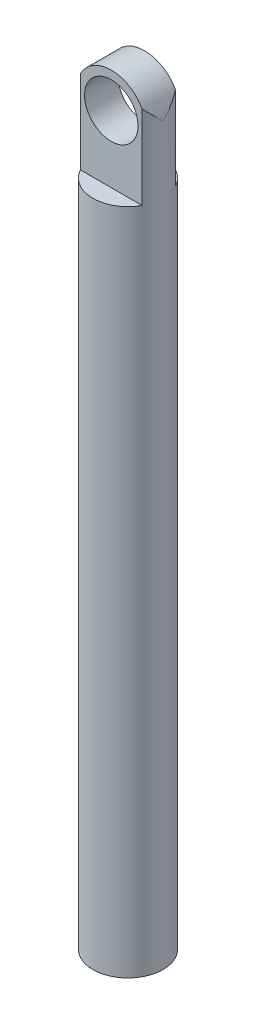
ISO-10303-21;
HEADER;
FILE_DESCRIPTION(('STEP AP214'),'2;1');
FILE_NAME('part.step','',(''),(''),'','','');
FILE_SCHEMA(('AUTOMOTIVE_DESIGN { 1 0 10303 214 1 1 1 1 }'));
ENDSEC;
DATA;
#1=APPLICATION_CONTEXT('core data for automotive mechanical design processes');
#2=APPLICATION_PROTOCOL_DEFINITION('international standard','automotive_design',2000,#1);
#3=PRODUCT_CONTEXT('',#1,'mechanical');
#4=PRODUCT('Part','Part','',(#3));
#5=PRODUCT_RELATED_PRODUCT_CATEGORY('part','',(#4));
#6=PRODUCT_DEFINITION_FORMATION('','',#4);
#7=PRODUCT_DEFINITION_CONTEXT('part definition',#1,'design');
#8=PRODUCT_DEFINITION('design','',#6,#7);
#9=PRODUCT_DEFINITION_SHAPE('','',#8);
#10=(LENGTH_UNIT() NAMED_UNIT(*) SI_UNIT(.MILLI.,.METRE.));
#11=(NAMED_UNIT(*) PLANE_ANGLE_UNIT() SI_UNIT($,.RADIAN.));
#12=(NAMED_UNIT(*) SI_UNIT($,.STERADIAN.) SOLID_ANGLE_UNIT());
#13=UNCERTAINTY_MEASURE_WITH_UNIT(LENGTH_MEASURE(1.E-05),#10,'distance_accuracy_value','');
#14=(GEOMETRIC_REPRESENTATION_CONTEXT(3) GLOBAL_UNCERTAINTY_ASSIGNED_CONTEXT((#13)) GLOBAL_UNIT_ASSIGNED_CONTEXT((#10,
#11,#12)) REPRESENTATION_CONTEXT('',''));
#15=CARTESIAN_POINT('',(0.,0.,0.));
#16=DIRECTION('',(0.,0.,1.));
#17=DIRECTION('',(1.,0.,0.));
#18=AXIS2_PLACEMENT_3D('',#15,#16,#17);
#19=CARTESIAN_POINT('',(0.,100.,0.));
#20=DIRECTION('',(0.,1.,0.));
#21=DIRECTION('',(0.,0.,1.));
#22=AXIS2_PLACEMENT_3D('',#19,#20,#21);
#23=PLANE('',#22);
#24=CARTESIAN_POINT('',(0.,100.,0.));
#25=DIRECTION('',(0.,1.,0.));
#26=DIRECTION('',(0.,0.,1.));
#27=AXIS2_PLACEMENT_3D('',#24,#25,#26);
#28=CIRCLE('',#27,5.25);
#29=CARTESIAN_POINT('',(4.61654632815485,100.,-2.5));
#30=VERTEX_POINT('',#29);
#31=CARTESIAN_POINT('',(-4.61654632815484,100.,-2.5));
#32=VERTEX_POINT('',#31);
#33=EDGE_CURVE('E104',#30,#32,#28,.T.);
#34=ORIENTED_EDGE('',*,*,#33,.T.);
#35=DIRECTION('',(1.,0.,0.));
#36=VECTOR('',#35,1.);
#37=CARTESIAN_POINT('',(-5.25,100.,-2.5));
#38=LINE('',#37,#36);
#39=EDGE_CURVE('E109',#32,#30,#38,.T.);
#40=ORIENTED_EDGE('',*,*,#39,.T.);
#41=EDGE_LOOP('',(#34,#40));
#42=FACE_BOUND('',#41,.T.);
#43=ADVANCED_FACE('F42',(#42),#23,.T.);
#44=CARTESIAN_POINT('',(0.,100.,0.));
#45=DIRECTION('',(0.,-1.,0.));
#46=DIRECTION('',(0.,0.,-1.));
#47=AXIS2_PLACEMENT_3D('',#44,#45,#46);
#48=CYLINDRICAL_SURFACE('',#47,5.25);
#49=DIRECTION('',(0.,-1.,0.));
#50=VECTOR('',#49,1.);
#51=CARTESIAN_POINT('',(4.61654632815484,115.25,2.5));
#52=LINE('',#51,#50);
#53=CARTESIAN_POINT('',(4.61654632815484,100.,2.5));
#54=VERTEX_POINT('',#53);
#55=CARTESIAN_POINT('',(4.61654632815484,112.5,2.5));
#56=VERTEX_POINT('',#55);
#57=EDGE_CURVE('E88',#54,#56,#52,.F.);
#58=ORIENTED_EDGE('',*,*,#57,.F.);
#59=CARTESIAN_POINT('',(-4.61654632815484,100.,2.5));
#60=VERTEX_POINT('',#59);
#61=EDGE_CURVE('E91',#60,#54,#28,.T.);
#62=ORIENTED_EDGE('',*,*,#61,.F.);
#63=DIRECTION('',(0.,-1.,0.));
#64=VECTOR('',#63,1.);
#65=CARTESIAN_POINT('',(-4.61654632815484,115.25,2.5));
#66=LINE('',#65,#64);
#67=CARTESIAN_POINT('',(-4.61654632815484,112.5,2.5));
#68=VERTEX_POINT('',#67);
#69=EDGE_CURVE('E108',#68,#60,#66,.T.);
#70=ORIENTED_EDGE('',*,*,#69,.F.);
#71=CARTESIAN_POINT('',(0.,110.,0.));
#72=DIRECTION('',(0.,0.707106781186547,-0.707106781186548));
#73=DIRECTION('',(0.,-0.707106781186547,-0.707106781186548));
#74=AXIS2_PLACEMENT_3D('',#71,#72,#73);
#75=ELLIPSE('',#74,7.42462120245875,5.25);
#76=CARTESIAN_POINT('',(-5.25,110.,0.));
#77=VERTEX_POINT('',#76);
#78=EDGE_CURVE('E98',#77,#68,#75,.T.);
#79=ORIENTED_EDGE('',*,*,#78,.F.);
#80=CARTESIAN_POINT('',(0.,110.,0.));
#81=DIRECTION('',(0.,-0.707106781186547,-0.707106781186548));
#82=DIRECTION('',(0.,0.707106781186547,-0.707106781186548));
#83=AXIS2_PLACEMENT_3D('',#80,#81,#82);
#84=ELLIPSE('',#83,7.42462120245875,5.25);
#85=CARTESIAN_POINT('',(-4.61654632815484,112.5,-2.5));
#86=VERTEX_POINT('',#85);
#87=EDGE_CURVE('E58',#86,#77,#84,.F.);
#88=ORIENTED_EDGE('',*,*,#87,.F.);
#89=DIRECTION('',(0.,-1.,0.));
#90=VECTOR('',#89,1.);
#91=CARTESIAN_POINT('',(-4.61654632815484,115.25,-2.5));
#92=LINE('',#91,#90);
#93=EDGE_CURVE('E51',#86,#32,#92,.T.);
#94=ORIENTED_EDGE('',*,*,#93,.T.);
#95=ORIENTED_EDGE('',*,*,#33,.F.);
#96=DIRECTION('',(0.,-1.,0.));
#97=VECTOR('',#96,1.);
#98=CARTESIAN_POINT('',(4.61654632815484,115.25,-2.5));
#99=LINE('',#98,#97);
#100=CARTESIAN_POINT('',(4.61654632815484,112.5,-2.5));
#101=VERTEX_POINT('',#100);
#102=EDGE_CURVE('E12',#30,#101,#99,.F.);
#103=ORIENTED_EDGE('',*,*,#102,.T.);
#104=CARTESIAN_POINT('',(5.25,110.,0.));
#105=VERTEX_POINT('',#104);
#106=EDGE_CURVE('E172',#105,#101,#84,.F.);
#107=ORIENTED_EDGE('',*,*,#106,.F.);
#108=EDGE_CURVE('E93',#56,#105,#75,.T.);
#109=ORIENTED_EDGE('',*,*,#108,.F.);
#110=EDGE_LOOP('',(#58,#62,#70,#79,#88,#94,#95,#103,#107,#109));
#111=FACE_BOUND('',#110,.T.);
#112=CARTESIAN_POINT('',(0.,0.,0.));
#113=DIRECTION('',(0.,1.,0.));
#114=DIRECTION('',(0.,0.,1.));
#115=AXIS2_PLACEMENT_3D('',#112,#113,#114);
#116=CIRCLE('',#115,5.25);
#117=CARTESIAN_POINT('',(0.,0.,5.25));
#118=VERTEX_POINT('',#117);
#119=EDGE_CURVE('E105',#118,#118,#116,.T.);
#120=ORIENTED_EDGE('',*,*,#119,.T.);
#121=EDGE_LOOP('',(#120));
#122=FACE_BOUND('',#121,.T.);
#123=ADVANCED_FACE('F44',(#111,#122),#48,.T.);
#124=DIRECTION('',(1.,0.,0.));
#125=VECTOR('',#124,1.);
#126=CARTESIAN_POINT('',(-5.25,100.,2.5));
#127=LINE('',#126,#125);
#128=EDGE_CURVE('E103',#60,#54,#127,.T.);
#129=ORIENTED_EDGE('',*,*,#128,.F.);
#130=ORIENTED_EDGE('',*,*,#61,.T.);
#131=EDGE_LOOP('',(#129,#130));
#132=FACE_BOUND('',#131,.T.);
#133=ADVANCED_FACE('F102',(#132),#23,.T.);
#134=CARTESIAN_POINT('',(0.,0.,0.));
#135=DIRECTION('',(0.,1.,0.));
#136=DIRECTION('',(0.,0.,1.));
#137=AXIS2_PLACEMENT_3D('',#134,#135,#136);
#138=PLANE('',#137);
#139=CARTESIAN_POINT('',(0.,0.,0.));
#140=DIRECTION('',(0.,-1.,0.));
#141=DIRECTION('',(0.,0.,-1.));
#142=AXIS2_PLACEMENT_3D('',#139,#140,#141);
#143=CIRCLE('',#142,2.65);
#144=CARTESIAN_POINT('',(0.,0.,-2.65));
#145=VERTEX_POINT('',#144);
#146=EDGE_CURVE('E160',#145,#145,#143,.T.);
#147=ORIENTED_EDGE('',*,*,#146,.F.);
#148=EDGE_LOOP('',(#147));
#149=FACE_BOUND('',#148,.T.);
#150=ORIENTED_EDGE('',*,*,#119,.F.);
#151=EDGE_LOOP('',(#150));
#152=FACE_BOUND('',#151,.T.);
#153=ADVANCED_FACE('F147',(#149,#152),#138,.F.);
#154=CARTESIAN_POINT('',(0.,110.,2.5));
#155=DIRECTION('',(0.,0.,-1.));
#156=DIRECTION('',(-1.,0.,0.));
#157=AXIS2_PLACEMENT_3D('',#154,#155,#156);
#158=CYLINDRICAL_SURFACE('',#157,5.25);
#159=CARTESIAN_POINT('',(0.,110.,-2.5));
#160=DIRECTION('',(0.,0.,1.));
#161=DIRECTION('',(-1.,0.,0.));
#162=AXIS2_PLACEMENT_3D('',#159,#160,#161);
#163=CIRCLE('',#162,5.25);
#164=EDGE_CURVE('E116',#101,#86,#163,.T.);
#165=ORIENTED_EDGE('',*,*,#164,.T.);
#166=ORIENTED_EDGE('',*,*,#87,.T.);
#167=ORIENTED_EDGE('',*,*,#78,.T.);
#168=CARTESIAN_POINT('',(0.,110.,2.5));
#169=DIRECTION('',(0.,0.,1.));
#170=DIRECTION('',(-1.,0.,0.));
#171=AXIS2_PLACEMENT_3D('',#168,#169,#170);
#172=CIRCLE('',#171,5.25);
#173=EDGE_CURVE('E115',#56,#68,#172,.T.);
#174=ORIENTED_EDGE('',*,*,#173,.F.);
#175=ORIENTED_EDGE('',*,*,#108,.T.);
#176=ORIENTED_EDGE('',*,*,#106,.T.);
#177=EDGE_LOOP('',(#165,#166,#167,#174,#175,#176));
#178=FACE_BOUND('',#177,.T.);
#179=ADVANCED_FACE('F136',(#178),#158,.T.);
#180=CARTESIAN_POINT('',(0.,110.,2.5));
#181=DIRECTION('',(0.,0.,-1.));
#182=DIRECTION('',(-1.,0.,0.));
#183=AXIS2_PLACEMENT_3D('',#180,#181,#182);
#184=PLANE('',#183);
#185=CARTESIAN_POINT('',(0.,110.,2.5));
#186=DIRECTION('',(0.,0.,1.));
#187=DIRECTION('',(1.,0.,0.));
#188=AXIS2_PLACEMENT_3D('',#185,#186,#187);
#189=CIRCLE('',#188,4.);
#190=CARTESIAN_POINT('',(4.,110.,2.5));
#191=VERTEX_POINT('',#190);
#192=EDGE_CURVE('E166',#191,#191,#189,.T.);
#193=ORIENTED_EDGE('',*,*,#192,.F.);
#194=EDGE_LOOP('',(#193));
#195=FACE_BOUND('',#194,.T.);
#196=ORIENTED_EDGE('',*,*,#128,.T.);
#197=ORIENTED_EDGE('',*,*,#57,.T.);
#198=ORIENTED_EDGE('',*,*,#173,.T.);
#199=ORIENTED_EDGE('',*,*,#69,.T.);
#200=EDGE_LOOP('',(#196,#197,#198,#199));
#201=FACE_BOUND('',#200,.T.);
#202=ADVANCED_FACE('F107',(#195,#201),#184,.F.);
#203=CARTESIAN_POINT('',(0.,110.,-2.5));
#204=DIRECTION('',(0.,0.,-1.));
#205=DIRECTION('',(-1.,0.,0.));
#206=AXIS2_PLACEMENT_3D('',#203,#204,#205);
#207=PLANE('',#206);
#208=CARTESIAN_POINT('',(0.,110.,-2.5));
#209=DIRECTION('',(0.,0.,-1.));
#210=DIRECTION('',(-1.,0.,0.));
#211=AXIS2_PLACEMENT_3D('',#208,#209,#210);
#212=CIRCLE('',#211,4.);
#213=CARTESIAN_POINT('',(-4.,110.,-2.5));
#214=VERTEX_POINT('',#213);
#215=EDGE_CURVE('E46',#214,#214,#212,.T.);
#216=ORIENTED_EDGE('',*,*,#215,.F.);
#217=EDGE_LOOP('',(#216));
#218=FACE_BOUND('',#217,.T.);
#219=ORIENTED_EDGE('',*,*,#102,.F.);
#220=ORIENTED_EDGE('',*,*,#39,.F.);
#221=ORIENTED_EDGE('',*,*,#93,.F.);
#222=ORIENTED_EDGE('',*,*,#164,.F.);
#223=EDGE_LOOP('',(#219,#220,#221,#222));
#224=FACE_BOUND('',#223,.T.);
#225=ADVANCED_FACE('F124',(#218,#224),#207,.T.);
#226=CARTESIAN_POINT('',(0.,110.,-5.25));
#227=DIRECTION('',(0.,0.,1.));
#228=DIRECTION('',(1.,0.,0.));
#229=AXIS2_PLACEMENT_3D('',#226,#227,#228);
#230=CYLINDRICAL_SURFACE('',#229,4.);
#231=ORIENTED_EDGE('',*,*,#215,.T.);
#232=EDGE_LOOP('',(#231));
#233=FACE_BOUND('',#232,.T.);
#234=ORIENTED_EDGE('',*,*,#192,.T.);
#235=EDGE_LOOP('',(#234));
#236=FACE_BOUND('',#235,.T.);
#237=ADVANCED_FACE('F126',(#233,#236),#230,.F.);
#238=CARTESIAN_POINT('',(0.,6.,0.));
#239=DIRECTION('',(0.,-1.,0.));
#240=DIRECTION('',(0.,0.,-1.));
#241=AXIS2_PLACEMENT_3D('',#238,#239,#240);
#242=CYLINDRICAL_SURFACE('',#241,2.65);
#243=CARTESIAN_POINT('',(0.,6.,0.));
#244=DIRECTION('',(0.,-1.,0.));
#245=DIRECTION('',(0.,0.,-1.));
#246=AXIS2_PLACEMENT_3D('',#243,#244,#245);
#247=CIRCLE('',#246,2.65);
#248=CARTESIAN_POINT('',(0.,6.,-2.65));
#249=VERTEX_POINT('',#248);
#250=EDGE_CURVE('E163',#249,#249,#247,.T.);
#251=ORIENTED_EDGE('',*,*,#250,.F.);
#252=EDGE_LOOP('',(#251));
#253=FACE_BOUND('',#252,.T.);
#254=ORIENTED_EDGE('',*,*,#146,.T.);
#255=EDGE_LOOP('',(#254));
#256=FACE_BOUND('',#255,.T.);
#257=ADVANCED_FACE('F133',(#253,#256),#242,.F.);
#258=CARTESIAN_POINT('',(0.,6.,0.));
#259=DIRECTION('',(0.,-1.,0.));
#260=DIRECTION('',(0.,0.,-1.));
#261=AXIS2_PLACEMENT_3D('',#258,#259,#260);
#262=PLANE('',#261);
#263=ORIENTED_EDGE('',*,*,#250,.T.);
#264=EDGE_LOOP('',(#263));
#265=FACE_BOUND('',#264,.T.);
#266=ADVANCED_FACE('F180',(#265),#262,.T.);
#267=CLOSED_SHELL('',(#43,#123,#133,#153,#179,#202,#225,#237,#257,#266));
#268=MANIFOLD_SOLID_BREP('B2',#267);
#269=ADVANCED_BREP_SHAPE_REPRESENTATION('',(#18,#268),#14);
#270=SHAPE_DEFINITION_REPRESENTATION(#9,#269);
ENDSEC;
END-ISO-10303-21;
